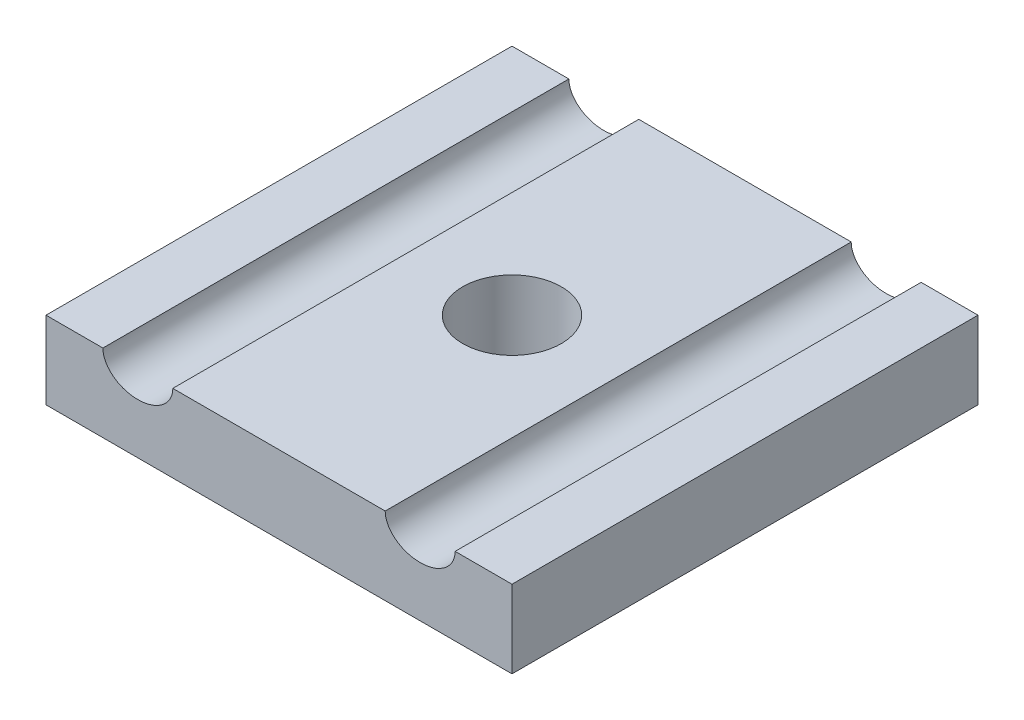
ISO-10303-21;
HEADER;
FILE_DESCRIPTION(('STEP AP214'),'2;1');
FILE_NAME('part.step','',(''),(''),'','','');
FILE_SCHEMA(('AUTOMOTIVE_DESIGN { 1 0 10303 214 1 1 1 1 }'));
ENDSEC;
DATA;
#1=APPLICATION_CONTEXT('core data for automotive mechanical design processes');
#2=APPLICATION_PROTOCOL_DEFINITION('international standard','automotive_design',2000,#1);
#3=PRODUCT_CONTEXT('',#1,'mechanical');
#4=PRODUCT('Part','Part','',(#3));
#5=PRODUCT_RELATED_PRODUCT_CATEGORY('part','',(#4));
#6=PRODUCT_DEFINITION_FORMATION('','',#4);
#7=PRODUCT_DEFINITION_CONTEXT('part definition',#1,'design');
#8=PRODUCT_DEFINITION('design','',#6,#7);
#9=PRODUCT_DEFINITION_SHAPE('','',#8);
#10=(LENGTH_UNIT() NAMED_UNIT(*) SI_UNIT(.MILLI.,.METRE.));
#11=(NAMED_UNIT(*) PLANE_ANGLE_UNIT() SI_UNIT($,.RADIAN.));
#12=(NAMED_UNIT(*) SI_UNIT($,.STERADIAN.) SOLID_ANGLE_UNIT());
#13=UNCERTAINTY_MEASURE_WITH_UNIT(LENGTH_MEASURE(1.E-05),#10,'distance_accuracy_value','');
#14=(GEOMETRIC_REPRESENTATION_CONTEXT(3) GLOBAL_UNCERTAINTY_ASSIGNED_CONTEXT((#13)) GLOBAL_UNIT_ASSIGNED_CONTEXT((#10,
#11,#12)) REPRESENTATION_CONTEXT('',''));
#15=CARTESIAN_POINT('',(0.,0.,0.));
#16=DIRECTION('',(0.,0.,1.));
#17=DIRECTION('',(1.,0.,0.));
#18=AXIS2_PLACEMENT_3D('',#15,#16,#17);
#19=CARTESIAN_POINT('',(0.,5.,0.));
#20=DIRECTION('',(0.,-1.,0.));
#21=DIRECTION('',(0.,0.,-1.));
#22=AXIS2_PLACEMENT_3D('',#19,#20,#21);
#23=PLANE('',#22);
#24=DIRECTION('',(-1.,0.,0.));
#25=VECTOR('',#24,1.);
#26=CARTESIAN_POINT('',(0.,5.,0.));
#27=LINE('',#26,#25);
#28=CARTESIAN_POINT('',(0.,5.,0.));
#29=VERTEX_POINT('',#28);
#30=CARTESIAN_POINT('',(-3.6625,5.,0.));
#31=VERTEX_POINT('',#30);
#32=EDGE_CURVE('E117',#29,#31,#27,.T.);
#33=ORIENTED_EDGE('',*,*,#32,.T.);
#34=DIRECTION('',(0.,0.,1.));
#35=VECTOR('',#34,1.);
#36=CARTESIAN_POINT('',(-3.6625,5.,15.));
#37=LINE('',#36,#35);
#38=CARTESIAN_POINT('',(-3.6625,5.,30.));
#39=VERTEX_POINT('',#38);
#40=EDGE_CURVE('E102',#31,#39,#37,.T.);
#41=ORIENTED_EDGE('',*,*,#40,.T.);
#42=DIRECTION('',(1.,0.,0.));
#43=VECTOR('',#42,1.);
#44=CARTESIAN_POINT('',(0.,5.,30.));
#45=LINE('',#44,#43);
#46=CARTESIAN_POINT('',(0.,5.,30.));
#47=VERTEX_POINT('',#46);
#48=EDGE_CURVE('E126',#39,#47,#45,.T.);
#49=ORIENTED_EDGE('',*,*,#48,.T.);
#50=DIRECTION('',(0.,0.,-1.));
#51=VECTOR('',#50,1.);
#52=CARTESIAN_POINT('',(0.,5.,0.));
#53=LINE('',#52,#51);
#54=EDGE_CURVE('E121',#47,#29,#53,.T.);
#55=ORIENTED_EDGE('',*,*,#54,.T.);
#56=EDGE_LOOP('',(#33,#41,#49,#55));
#57=FACE_BOUND('',#56,.T.);
#58=ADVANCED_FACE('F35',(#57),#23,.F.);
#59=CARTESIAN_POINT('',(-15.,5.,15.));
#60=DIRECTION('',(0.,1.,0.));
#61=DIRECTION('',(0.,0.,1.));
#62=AXIS2_PLACEMENT_3D('',#59,#60,#61);
#63=CIRCLE('',#62,3.175);
#64=CARTESIAN_POINT('',(-15.,5.,18.175));
#65=VERTEX_POINT('',#64);
#66=EDGE_CURVE('E167',#65,#65,#63,.T.);
#67=ORIENTED_EDGE('',*,*,#66,.F.);
#68=EDGE_LOOP('',(#67));
#69=FACE_BOUND('',#68,.T.);
#70=CARTESIAN_POINT('',(-21.8375,5.,30.));
#71=VERTEX_POINT('',#70);
#72=CARTESIAN_POINT('',(-8.1625,5.,30.));
#73=VERTEX_POINT('',#72);
#74=EDGE_CURVE('E113',#71,#73,#45,.T.);
#75=ORIENTED_EDGE('',*,*,#74,.T.);
#76=DIRECTION('',(0.,0.,1.));
#77=VECTOR('',#76,1.);
#78=CARTESIAN_POINT('',(-8.1625,5.,15.));
#79=LINE('',#78,#77);
#80=CARTESIAN_POINT('',(-8.1625,5.,0.));
#81=VERTEX_POINT('',#80);
#82=EDGE_CURVE('E50',#73,#81,#79,.F.);
#83=ORIENTED_EDGE('',*,*,#82,.T.);
#84=CARTESIAN_POINT('',(-21.8375,5.,0.));
#85=VERTEX_POINT('',#84);
#86=EDGE_CURVE('E111',#81,#85,#27,.T.);
#87=ORIENTED_EDGE('',*,*,#86,.T.);
#88=DIRECTION('',(0.,0.,1.));
#89=VECTOR('',#88,1.);
#90=CARTESIAN_POINT('',(-21.8375,5.,15.));
#91=LINE('',#90,#89);
#92=EDGE_CURVE('E11',#85,#71,#91,.T.);
#93=ORIENTED_EDGE('',*,*,#92,.T.);
#94=EDGE_LOOP('',(#75,#83,#87,#93));
#95=FACE_BOUND('',#94,.T.);
#96=ADVANCED_FACE('F110',(#69,#95),#23,.F.);
#97=CARTESIAN_POINT('',(0.,5.,0.));
#98=DIRECTION('',(-1.,0.,0.));
#99=DIRECTION('',(0.,0.,1.));
#100=AXIS2_PLACEMENT_3D('',#97,#98,#99);
#101=PLANE('',#100);
#102=DIRECTION('',(0.,0.,-1.));
#103=VECTOR('',#102,1.);
#104=CARTESIAN_POINT('',(0.,0.,0.));
#105=LINE('',#104,#103);
#106=CARTESIAN_POINT('',(0.,0.,30.));
#107=VERTEX_POINT('',#106);
#108=CARTESIAN_POINT('',(0.,0.,0.));
#109=VERTEX_POINT('',#108);
#110=EDGE_CURVE('E131',#107,#109,#105,.T.);
#111=ORIENTED_EDGE('',*,*,#110,.T.);
#112=DIRECTION('',(0.,-1.,0.));
#113=VECTOR('',#112,1.);
#114=CARTESIAN_POINT('',(0.,5.,0.));
#115=LINE('',#114,#113);
#116=EDGE_CURVE('E149',#29,#109,#115,.T.);
#117=ORIENTED_EDGE('',*,*,#116,.F.);
#118=ORIENTED_EDGE('',*,*,#54,.F.);
#119=DIRECTION('',(0.,-1.,0.));
#120=VECTOR('',#119,1.);
#121=CARTESIAN_POINT('',(0.,5.,30.));
#122=LINE('',#121,#120);
#123=EDGE_CURVE('E130',#47,#107,#122,.T.);
#124=ORIENTED_EDGE('',*,*,#123,.T.);
#125=EDGE_LOOP('',(#111,#117,#118,#124));
#126=FACE_BOUND('',#125,.T.);
#127=ADVANCED_FACE('F37',(#126),#101,.F.);
#128=CARTESIAN_POINT('',(0.,5.,0.));
#129=DIRECTION('',(0.,0.,1.));
#130=DIRECTION('',(1.,0.,0.));
#131=AXIS2_PLACEMENT_3D('',#128,#129,#130);
#132=PLANE('',#131);
#133=ORIENTED_EDGE('',*,*,#86,.F.);
#134=CARTESIAN_POINT('',(-5.9125,5.,0.));
#135=DIRECTION('',(0.,0.,1.));
#136=DIRECTION('',(-1.,0.,0.));
#137=AXIS2_PLACEMENT_3D('',#134,#135,#136);
#138=ELLIPSE('',#137,2.25,1.75);
#139=EDGE_CURVE('E99',#31,#81,#138,.F.);
#140=ORIENTED_EDGE('',*,*,#139,.F.);
#141=ORIENTED_EDGE('',*,*,#32,.F.);
#142=ORIENTED_EDGE('',*,*,#116,.T.);
#143=DIRECTION('',(-1.,0.,0.));
#144=VECTOR('',#143,1.);
#145=CARTESIAN_POINT('',(0.,0.,0.));
#146=LINE('',#145,#144);
#147=CARTESIAN_POINT('',(-30.,0.,0.));
#148=VERTEX_POINT('',#147);
#149=EDGE_CURVE('E134',#109,#148,#146,.T.);
#150=ORIENTED_EDGE('',*,*,#149,.T.);
#151=DIRECTION('',(0.,-1.,0.));
#152=VECTOR('',#151,1.);
#153=CARTESIAN_POINT('',(-30.,5.,0.));
#154=LINE('',#153,#152);
#155=CARTESIAN_POINT('',(-30.,5.,0.));
#156=VERTEX_POINT('',#155);
#157=EDGE_CURVE('E146',#156,#148,#154,.T.);
#158=ORIENTED_EDGE('',*,*,#157,.F.);
#159=CARTESIAN_POINT('',(-26.3375,5.,0.));
#160=VERTEX_POINT('',#159);
#161=EDGE_CURVE('E118',#160,#156,#27,.T.);
#162=ORIENTED_EDGE('',*,*,#161,.F.);
#163=CARTESIAN_POINT('',(-24.0875,5.,0.));
#164=DIRECTION('',(0.,0.,1.));
#165=DIRECTION('',(-1.,0.,0.));
#166=AXIS2_PLACEMENT_3D('',#163,#164,#165);
#167=ELLIPSE('',#166,2.25,1.75);
#168=EDGE_CURVE('E58',#85,#160,#167,.F.);
#169=ORIENTED_EDGE('',*,*,#168,.F.);
#170=EDGE_LOOP('',(#133,#140,#141,#142,#150,#158,#162,#169));
#171=FACE_BOUND('',#170,.T.);
#172=ADVANCED_FACE('F115',(#171),#132,.F.);
#173=CARTESIAN_POINT('',(-30.,5.,0.));
#174=DIRECTION('',(1.,0.,0.));
#175=DIRECTION('',(0.,0.,-1.));
#176=AXIS2_PLACEMENT_3D('',#173,#174,#175);
#177=PLANE('',#176);
#178=DIRECTION('',(0.,0.,1.));
#179=VECTOR('',#178,1.);
#180=CARTESIAN_POINT('',(-30.,0.,0.));
#181=LINE('',#180,#179);
#182=CARTESIAN_POINT('',(-30.,0.,30.));
#183=VERTEX_POINT('',#182);
#184=EDGE_CURVE('E137',#148,#183,#181,.T.);
#185=ORIENTED_EDGE('',*,*,#184,.T.);
#186=DIRECTION('',(0.,-1.,0.));
#187=VECTOR('',#186,1.);
#188=CARTESIAN_POINT('',(-30.,5.,30.));
#189=LINE('',#188,#187);
#190=CARTESIAN_POINT('',(-30.,5.,30.));
#191=VERTEX_POINT('',#190);
#192=EDGE_CURVE('E143',#191,#183,#189,.T.);
#193=ORIENTED_EDGE('',*,*,#192,.F.);
#194=DIRECTION('',(0.,0.,1.));
#195=VECTOR('',#194,1.);
#196=CARTESIAN_POINT('',(-30.,5.,0.));
#197=LINE('',#196,#195);
#198=EDGE_CURVE('E120',#156,#191,#197,.T.);
#199=ORIENTED_EDGE('',*,*,#198,.F.);
#200=ORIENTED_EDGE('',*,*,#157,.T.);
#201=EDGE_LOOP('',(#185,#193,#199,#200));
#202=FACE_BOUND('',#201,.T.);
#203=ADVANCED_FACE('F160',(#202),#177,.F.);
#204=CARTESIAN_POINT('',(0.,5.,30.));
#205=DIRECTION('',(0.,0.,-1.));
#206=DIRECTION('',(-1.,0.,0.));
#207=AXIS2_PLACEMENT_3D('',#204,#205,#206);
#208=PLANE('',#207);
#209=ORIENTED_EDGE('',*,*,#48,.F.);
#210=CARTESIAN_POINT('',(-5.9125,5.,30.));
#211=DIRECTION('',(0.,0.,1.));
#212=DIRECTION('',(-1.,0.,0.));
#213=AXIS2_PLACEMENT_3D('',#210,#211,#212);
#214=ELLIPSE('',#213,2.25,1.75);
#215=EDGE_CURVE('E106',#73,#39,#214,.T.);
#216=ORIENTED_EDGE('',*,*,#215,.F.);
#217=ORIENTED_EDGE('',*,*,#74,.F.);
#218=CARTESIAN_POINT('',(-24.0875,5.,30.));
#219=DIRECTION('',(0.,0.,1.));
#220=DIRECTION('',(-1.,0.,0.));
#221=AXIS2_PLACEMENT_3D('',#218,#219,#220);
#222=ELLIPSE('',#221,2.25,1.75);
#223=CARTESIAN_POINT('',(-26.3375,5.,30.));
#224=VERTEX_POINT('',#223);
#225=EDGE_CURVE('E165',#224,#71,#222,.T.);
#226=ORIENTED_EDGE('',*,*,#225,.F.);
#227=EDGE_CURVE('E127',#191,#224,#45,.T.);
#228=ORIENTED_EDGE('',*,*,#227,.F.);
#229=ORIENTED_EDGE('',*,*,#192,.T.);
#230=DIRECTION('',(1.,0.,0.));
#231=VECTOR('',#230,1.);
#232=CARTESIAN_POINT('',(0.,0.,30.));
#233=LINE('',#232,#231);
#234=EDGE_CURVE('E139',#183,#107,#233,.T.);
#235=ORIENTED_EDGE('',*,*,#234,.T.);
#236=ORIENTED_EDGE('',*,*,#123,.F.);
#237=EDGE_LOOP('',(#209,#216,#217,#226,#228,#229,#235,#236));
#238=FACE_BOUND('',#237,.T.);
#239=ADVANCED_FACE('F164',(#238),#208,.F.);
#240=ORIENTED_EDGE('',*,*,#227,.T.);
#241=DIRECTION('',(0.,0.,1.));
#242=VECTOR('',#241,1.);
#243=CARTESIAN_POINT('',(-26.3375,5.,15.));
#244=LINE('',#243,#242);
#245=EDGE_CURVE('E43',#224,#160,#244,.F.);
#246=ORIENTED_EDGE('',*,*,#245,.T.);
#247=ORIENTED_EDGE('',*,*,#161,.T.);
#248=ORIENTED_EDGE('',*,*,#198,.T.);
#249=EDGE_LOOP('',(#240,#246,#247,#248));
#250=FACE_BOUND('',#249,.T.);
#251=ADVANCED_FACE('F152',(#250),#23,.F.);
#252=CARTESIAN_POINT('',(0.,0.,0.));
#253=DIRECTION('',(0.,-1.,0.));
#254=DIRECTION('',(0.,0.,-1.));
#255=AXIS2_PLACEMENT_3D('',#252,#253,#254);
#256=PLANE('',#255);
#257=CARTESIAN_POINT('',(-15.,0.,15.));
#258=DIRECTION('',(0.,1.,0.));
#259=DIRECTION('',(0.,0.,1.));
#260=AXIS2_PLACEMENT_3D('',#257,#258,#259);
#261=CIRCLE('',#260,3.175);
#262=CARTESIAN_POINT('',(-15.,0.,18.175));
#263=VERTEX_POINT('',#262);
#264=EDGE_CURVE('E135',#263,#263,#261,.T.);
#265=ORIENTED_EDGE('',*,*,#264,.T.);
#266=EDGE_LOOP('',(#265));
#267=FACE_BOUND('',#266,.T.);
#268=ORIENTED_EDGE('',*,*,#110,.F.);
#269=ORIENTED_EDGE('',*,*,#234,.F.);
#270=ORIENTED_EDGE('',*,*,#184,.F.);
#271=ORIENTED_EDGE('',*,*,#149,.F.);
#272=EDGE_LOOP('',(#268,#269,#270,#271));
#273=FACE_BOUND('',#272,.T.);
#274=ADVANCED_FACE('F190',(#267,#273),#256,.T.);
#275=CARTESIAN_POINT('',(-15.,0.,15.));
#276=DIRECTION('',(0.,1.,0.));
#277=DIRECTION('',(0.,0.,1.));
#278=AXIS2_PLACEMENT_3D('',#275,#276,#277);
#279=CYLINDRICAL_SURFACE('',#278,3.175);
#280=ORIENTED_EDGE('',*,*,#264,.F.);
#281=EDGE_LOOP('',(#280));
#282=FACE_BOUND('',#281,.T.);
#283=ORIENTED_EDGE('',*,*,#66,.T.);
#284=EDGE_LOOP('',(#283));
#285=FACE_BOUND('',#284,.T.);
#286=ADVANCED_FACE('F177',(#282,#285),#279,.F.);
#287=CARTESIAN_POINT('',(-24.0875,5.,-5.70087712549569));
#288=DIRECTION('',(0.,0.,1.));
#289=DIRECTION('',(-1.,0.,0.));
#290=AXIS2_PLACEMENT_3D('',#287,#288,#289);
#291=ELLIPSE('',#290,2.25,1.75);
#292=DIRECTION('',(0.,0.,1.));
#293=VECTOR('',#292,1.);
#294=SURFACE_OF_LINEAR_EXTRUSION('',#291,#293);
#295=ORIENTED_EDGE('',*,*,#168,.T.);
#296=ORIENTED_EDGE('',*,*,#245,.F.);
#297=ORIENTED_EDGE('',*,*,#225,.T.);
#298=ORIENTED_EDGE('',*,*,#92,.F.);
#299=EDGE_LOOP('',(#295,#296,#297,#298));
#300=FACE_BOUND('',#299,.T.);
#301=ADVANCED_FACE('F229',(#300),#294,.F.);
#302=CARTESIAN_POINT('',(-5.9125,5.,-5.70087712549569));
#303=DIRECTION('',(0.,0.,1.));
#304=DIRECTION('',(-1.,0.,0.));
#305=AXIS2_PLACEMENT_3D('',#302,#303,#304);
#306=ELLIPSE('',#305,2.25,1.75);
#307=DIRECTION('',(0.,0.,1.));
#308=VECTOR('',#307,1.);
#309=SURFACE_OF_LINEAR_EXTRUSION('',#306,#308);
#310=ORIENTED_EDGE('',*,*,#139,.T.);
#311=ORIENTED_EDGE('',*,*,#82,.F.);
#312=ORIENTED_EDGE('',*,*,#215,.T.);
#313=ORIENTED_EDGE('',*,*,#40,.F.);
#314=EDGE_LOOP('',(#310,#311,#312,#313));
#315=FACE_BOUND('',#314,.T.);
#316=ADVANCED_FACE('F100',(#315),#309,.F.);
#317=CLOSED_SHELL('',(#58,#96,#127,#172,#203,#239,#251,#274,#286,#301,#316));
#318=MANIFOLD_SOLID_BREP('B2',#317);
#319=ADVANCED_BREP_SHAPE_REPRESENTATION('',(#18,#318),#14);
#320=SHAPE_DEFINITION_REPRESENTATION(#9,#319);
ENDSEC;
END-ISO-10303-21;
